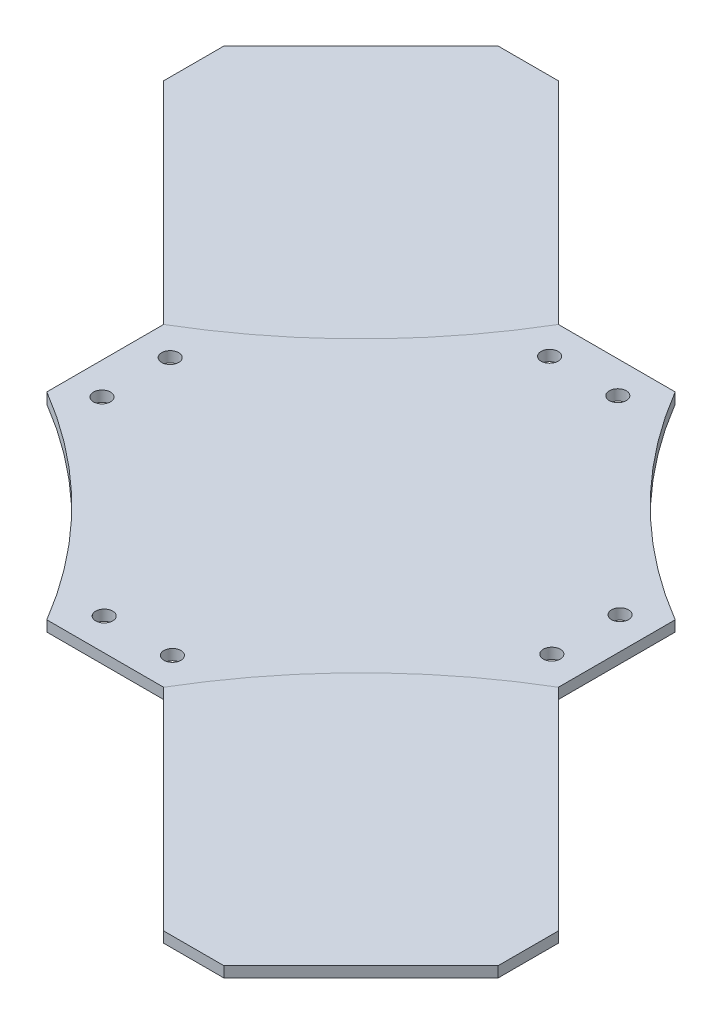
ISO-10303-21;
HEADER;
FILE_DESCRIPTION(('STEP AP214'),'2;1');
FILE_NAME('part.step','',(''),(''),'','','');
FILE_SCHEMA(('AUTOMOTIVE_DESIGN { 1 0 10303 214 1 1 1 1 }'));
ENDSEC;
DATA;
#1=APPLICATION_CONTEXT('core data for automotive mechanical design processes');
#2=APPLICATION_PROTOCOL_DEFINITION('international standard','automotive_design',2000,#1);
#3=PRODUCT_CONTEXT('',#1,'mechanical');
#4=PRODUCT('Part','Part','',(#3));
#5=PRODUCT_RELATED_PRODUCT_CATEGORY('part','',(#4));
#6=PRODUCT_DEFINITION_FORMATION('','',#4);
#7=PRODUCT_DEFINITION_CONTEXT('part definition',#1,'design');
#8=PRODUCT_DEFINITION('design','',#6,#7);
#9=PRODUCT_DEFINITION_SHAPE('','',#8);
#10=(LENGTH_UNIT() NAMED_UNIT(*) SI_UNIT(.MILLI.,.METRE.));
#11=(NAMED_UNIT(*) PLANE_ANGLE_UNIT() SI_UNIT($,.RADIAN.));
#12=(NAMED_UNIT(*) SI_UNIT($,.STERADIAN.) SOLID_ANGLE_UNIT());
#13=UNCERTAINTY_MEASURE_WITH_UNIT(LENGTH_MEASURE(1.E-05),#10,'distance_accuracy_value','');
#14=(GEOMETRIC_REPRESENTATION_CONTEXT(3) GLOBAL_UNCERTAINTY_ASSIGNED_CONTEXT((#13)) GLOBAL_UNIT_ASSIGNED_CONTEXT((#10,
#11,#12)) REPRESENTATION_CONTEXT('',''));
#15=CARTESIAN_POINT('',(0.,0.,0.));
#16=DIRECTION('',(0.,0.,1.));
#17=DIRECTION('',(1.,0.,0.));
#18=AXIS2_PLACEMENT_3D('',#15,#16,#17);
#19=CARTESIAN_POINT('',(126.747724256715,0.,126.747724256715));
#20=DIRECTION('',(0.,1.,0.));
#21=DIRECTION('',(-1.,0.,0.));
#22=AXIS2_PLACEMENT_3D('',#19,#20,#21);
#23=CYLINDRICAL_SURFACE('',#22,131.282316604609);
#24=CARTESIAN_POINT('',(126.747724256715,2.5,126.747724256715));
#25=DIRECTION('',(0.,-1.,0.));
#26=DIRECTION('',(-1.,0.,0.));
#27=AXIS2_PLACEMENT_3D('',#24,#25,#26);
#28=CIRCLE('',#27,131.282316604609);
#29=CARTESIAN_POINT('',(13.7000000000004,2.5,60.));
#30=VERTEX_POINT('',#29);
#31=CARTESIAN_POINT('',(59.9999999999999,2.5,13.7000000000003));
#32=VERTEX_POINT('',#31);
#33=EDGE_CURVE('E129',#30,#32,#28,.T.);
#34=ORIENTED_EDGE('',*,*,#33,.T.);
#35=DIRECTION('',(0.,1.,0.));
#36=VECTOR('',#35,1.);
#37=CARTESIAN_POINT('',(59.9999999999999,0.,13.7000000000003));
#38=LINE('',#37,#36);
#39=CARTESIAN_POINT('',(59.9999999999999,0.,13.7000000000003));
#40=VERTEX_POINT('',#39);
#41=EDGE_CURVE('E48',#40,#32,#38,.T.);
#42=ORIENTED_EDGE('',*,*,#41,.F.);
#43=CARTESIAN_POINT('',(126.747724256715,0.,126.747724256715));
#44=DIRECTION('',(0.,-1.,0.));
#45=DIRECTION('',(-1.,0.,0.));
#46=AXIS2_PLACEMENT_3D('',#43,#44,#45);
#47=CIRCLE('',#46,131.282316604609);
#48=CARTESIAN_POINT('',(13.7000000000004,0.,60.));
#49=VERTEX_POINT('',#48);
#50=EDGE_CURVE('E138',#49,#40,#47,.T.);
#51=ORIENTED_EDGE('',*,*,#50,.F.);
#52=DIRECTION('',(0.,1.,0.));
#53=VECTOR('',#52,1.);
#54=CARTESIAN_POINT('',(13.7000000000004,0.,60.));
#55=LINE('',#54,#53);
#56=EDGE_CURVE('E12',#49,#30,#55,.T.);
#57=ORIENTED_EDGE('',*,*,#56,.T.);
#58=EDGE_LOOP('',(#34,#42,#51,#57));
#59=FACE_BOUND('',#58,.T.);
#60=ADVANCED_FACE('F45',(#59),#23,.T.);
#61=CARTESIAN_POINT('',(13.7000000000004,0.,60.));
#62=DIRECTION('',(-0.707106781186547,0.,0.707106781186548));
#63=DIRECTION('',(-0.707106781186548,0.,-0.707106781186547));
#64=AXIS2_PLACEMENT_3D('',#61,#62,#63);
#65=PLANE('',#64);
#66=DIRECTION('',(-0.707106781186548,0.,-0.707106781186547));
#67=VECTOR('',#66,1.);
#68=CARTESIAN_POINT('',(13.7000000000004,2.5,60.));
#69=LINE('',#68,#67);
#70=CARTESIAN_POINT('',(63.1974746830588,2.5,109.497474683058));
#71=VERTEX_POINT('',#70);
#72=EDGE_CURVE('E92',#71,#30,#69,.T.);
#73=ORIENTED_EDGE('',*,*,#72,.T.);
#74=ORIENTED_EDGE('',*,*,#56,.F.);
#75=DIRECTION('',(-0.707106781186548,0.,-0.707106781186547));
#76=VECTOR('',#75,1.);
#77=CARTESIAN_POINT('',(13.7000000000004,0.,60.));
#78=LINE('',#77,#76);
#79=CARTESIAN_POINT('',(63.1974746830588,0.,109.497474683058));
#80=VERTEX_POINT('',#79);
#81=EDGE_CURVE('E63',#80,#49,#78,.T.);
#82=ORIENTED_EDGE('',*,*,#81,.F.);
#83=DIRECTION('',(0.,1.,0.));
#84=VECTOR('',#83,1.);
#85=CARTESIAN_POINT('',(63.1974746830588,0.,109.497474683058));
#86=LINE('',#85,#84);
#87=EDGE_CURVE('E54',#80,#71,#86,.T.);
#88=ORIENTED_EDGE('',*,*,#87,.T.);
#89=EDGE_LOOP('',(#73,#74,#82,#88));
#90=FACE_BOUND('',#89,.T.);
#91=ADVANCED_FACE('F163',(#90),#65,.T.);
#92=CARTESIAN_POINT('',(63.1974746830588,0.,109.497474683058));
#93=DIRECTION('',(0.,0.,1.));
#94=DIRECTION('',(-1.,0.,0.));
#95=AXIS2_PLACEMENT_3D('',#92,#93,#94);
#96=PLANE('',#95);
#97=DIRECTION('',(-1.,0.,0.));
#98=VECTOR('',#97,1.);
#99=CARTESIAN_POINT('',(63.1974746830588,2.5,109.497474683058));
#100=LINE('',#99,#98);
#101=CARTESIAN_POINT('',(77.3396103067897,2.5,109.497474683058));
#102=VERTEX_POINT('',#101);
#103=EDGE_CURVE('E86',#102,#71,#100,.T.);
#104=ORIENTED_EDGE('',*,*,#103,.T.);
#105=ORIENTED_EDGE('',*,*,#87,.F.);
#106=DIRECTION('',(-1.,0.,0.));
#107=VECTOR('',#106,1.);
#108=CARTESIAN_POINT('',(63.1974746830588,0.,109.497474683058));
#109=LINE('',#108,#107);
#110=CARTESIAN_POINT('',(77.3396103067897,0.,109.497474683058));
#111=VERTEX_POINT('',#110);
#112=EDGE_CURVE('E111',#111,#80,#109,.T.);
#113=ORIENTED_EDGE('',*,*,#112,.F.);
#114=DIRECTION('',(0.,1.,0.));
#115=VECTOR('',#114,1.);
#116=CARTESIAN_POINT('',(77.3396103067897,0.,109.497474683058));
#117=LINE('',#116,#115);
#118=EDGE_CURVE('E118',#111,#102,#117,.T.);
#119=ORIENTED_EDGE('',*,*,#118,.T.);
#120=EDGE_LOOP('',(#104,#105,#113,#119));
#121=FACE_BOUND('',#120,.T.);
#122=ADVANCED_FACE('F124',(#121),#96,.T.);
#123=CARTESIAN_POINT('',(109.497474683058,0.,77.3396103067897));
#124=DIRECTION('',(0.707106781186545,0.,0.70710678118655));
#125=DIRECTION('',(-0.70710678118655,0.,0.707106781186545));
#126=AXIS2_PLACEMENT_3D('',#123,#124,#125);
#127=PLANE('',#126);
#128=DIRECTION('',(-0.70710678118655,0.,0.707106781186545));
#129=VECTOR('',#128,1.);
#130=CARTESIAN_POINT('',(109.497474683058,2.5,77.3396103067897));
#131=LINE('',#130,#129);
#132=CARTESIAN_POINT('',(109.497474683058,2.5,77.3396103067897));
#133=VERTEX_POINT('',#132);
#134=EDGE_CURVE('E121',#133,#102,#131,.T.);
#135=ORIENTED_EDGE('',*,*,#134,.T.);
#136=ORIENTED_EDGE('',*,*,#118,.F.);
#137=DIRECTION('',(-0.70710678118655,0.,0.707106781186545));
#138=VECTOR('',#137,1.);
#139=CARTESIAN_POINT('',(109.497474683058,0.,77.3396103067897));
#140=LINE('',#139,#138);
#141=CARTESIAN_POINT('',(109.497474683058,0.,77.3396103067897));
#142=VERTEX_POINT('',#141);
#143=EDGE_CURVE('E107',#142,#111,#140,.T.);
#144=ORIENTED_EDGE('',*,*,#143,.F.);
#145=DIRECTION('',(0.,1.,0.));
#146=VECTOR('',#145,1.);
#147=CARTESIAN_POINT('',(109.497474683058,0.,77.3396103067897));
#148=LINE('',#147,#146);
#149=EDGE_CURVE('E122',#142,#133,#148,.T.);
#150=ORIENTED_EDGE('',*,*,#149,.T.);
#151=EDGE_LOOP('',(#135,#136,#144,#150));
#152=FACE_BOUND('',#151,.T.);
#153=ADVANCED_FACE('F119',(#152),#127,.T.);
#154=CARTESIAN_POINT('',(109.497474683059,0.,63.1974746830588));
#155=DIRECTION('',(1.,0.,0.));
#156=DIRECTION('',(0.,0.,1.));
#157=AXIS2_PLACEMENT_3D('',#154,#155,#156);
#158=PLANE('',#157);
#159=DIRECTION('',(0.,0.,1.));
#160=VECTOR('',#159,1.);
#161=CARTESIAN_POINT('',(109.497474683059,2.5,63.1974746830588));
#162=LINE('',#161,#160);
#163=CARTESIAN_POINT('',(109.497474683059,2.5,63.1974746830588));
#164=VERTEX_POINT('',#163);
#165=EDGE_CURVE('E134',#164,#133,#162,.T.);
#166=ORIENTED_EDGE('',*,*,#165,.T.);
#167=ORIENTED_EDGE('',*,*,#149,.F.);
#168=DIRECTION('',(0.,0.,1.));
#169=VECTOR('',#168,1.);
#170=CARTESIAN_POINT('',(109.497474683059,0.,63.1974746830588));
#171=LINE('',#170,#169);
#172=CARTESIAN_POINT('',(109.497474683059,0.,63.1974746830588));
#173=VERTEX_POINT('',#172);
#174=EDGE_CURVE('E113',#173,#142,#171,.T.);
#175=ORIENTED_EDGE('',*,*,#174,.F.);
#176=DIRECTION('',(0.,1.,0.));
#177=VECTOR('',#176,1.);
#178=CARTESIAN_POINT('',(109.497474683059,0.,63.1974746830588));
#179=LINE('',#178,#177);
#180=EDGE_CURVE('E141',#173,#164,#179,.T.);
#181=ORIENTED_EDGE('',*,*,#180,.T.);
#182=EDGE_LOOP('',(#166,#167,#175,#181));
#183=FACE_BOUND('',#182,.T.);
#184=ADVANCED_FACE('F152',(#183),#158,.T.);
#185=CARTESIAN_POINT('',(59.9999999999999,0.,13.7000000000003));
#186=DIRECTION('',(0.707106781186547,0.,-0.707106781186548));
#187=DIRECTION('',(0.707106781186548,0.,0.707106781186547));
#188=AXIS2_PLACEMENT_3D('',#185,#186,#187);
#189=PLANE('',#188);
#190=DIRECTION('',(0.707106781186548,0.,0.707106781186547));
#191=VECTOR('',#190,1.);
#192=CARTESIAN_POINT('',(59.9999999999999,2.5,13.7000000000003));
#193=LINE('',#192,#191);
#194=EDGE_CURVE('E132',#32,#164,#193,.T.);
#195=ORIENTED_EDGE('',*,*,#194,.T.);
#196=ORIENTED_EDGE('',*,*,#180,.F.);
#197=DIRECTION('',(0.707106781186548,0.,0.707106781186547));
#198=VECTOR('',#197,1.);
#199=CARTESIAN_POINT('',(59.9999999999999,0.,13.7000000000003));
#200=LINE('',#199,#198);
#201=EDGE_CURVE('E100',#40,#173,#200,.T.);
#202=ORIENTED_EDGE('',*,*,#201,.F.);
#203=ORIENTED_EDGE('',*,*,#41,.T.);
#204=EDGE_LOOP('',(#195,#196,#202,#203));
#205=FACE_BOUND('',#204,.T.);
#206=ADVANCED_FACE('F146',(#205),#189,.T.);
#207=CARTESIAN_POINT('',(126.747724256715,0.,126.747724256715));
#208=DIRECTION('',(0.,1.,0.));
#209=DIRECTION('',(-1.,0.,0.));
#210=AXIS2_PLACEMENT_3D('',#207,#208,#209);
#211=PLANE('',#210);
#212=ORIENTED_EDGE('',*,*,#50,.T.);
#213=ORIENTED_EDGE('',*,*,#201,.T.);
#214=ORIENTED_EDGE('',*,*,#174,.T.);
#215=ORIENTED_EDGE('',*,*,#143,.T.);
#216=ORIENTED_EDGE('',*,*,#112,.T.);
#217=ORIENTED_EDGE('',*,*,#81,.T.);
#218=EDGE_LOOP('',(#212,#213,#214,#215,#216,#217));
#219=FACE_BOUND('',#218,.T.);
#220=ADVANCED_FACE('F109',(#219),#211,.F.);
#221=CARTESIAN_POINT('',(126.747724256715,2.5,126.747724256715));
#222=DIRECTION('',(0.,1.,0.));
#223=DIRECTION('',(-1.,0.,0.));
#224=AXIS2_PLACEMENT_3D('',#221,#222,#223);
#225=PLANE('',#224);
#226=ORIENTED_EDGE('',*,*,#33,.F.);
#227=ORIENTED_EDGE('',*,*,#72,.F.);
#228=ORIENTED_EDGE('',*,*,#103,.F.);
#229=ORIENTED_EDGE('',*,*,#134,.F.);
#230=ORIENTED_EDGE('',*,*,#165,.F.);
#231=ORIENTED_EDGE('',*,*,#194,.F.);
#232=EDGE_LOOP('',(#226,#227,#228,#229,#230,#231));
#233=FACE_BOUND('',#232,.T.);
#234=ADVANCED_FACE('F151',(#233),#225,.T.);
#235=CLOSED_SHELL('',(#60,#91,#122,#153,#184,#206,#220,#234));
#236=MANIFOLD_SOLID_BREP('B2',#235);
#237=CARTESIAN_POINT('',(-126.747724256714,0.,-126.747724256716));
#238=DIRECTION('',(0.,1.,0.));
#239=DIRECTION('',(0.,0.,1.));
#240=AXIS2_PLACEMENT_3D('',#237,#238,#239);
#241=CYLINDRICAL_SURFACE('',#240,131.282316604609);
#242=CARTESIAN_POINT('',(-126.747724256714,2.5,-126.747724256716));
#243=DIRECTION('',(0.,1.,0.));
#244=DIRECTION('',(0.,0.,1.));
#245=AXIS2_PLACEMENT_3D('',#242,#243,#244);
#246=CIRCLE('',#245,131.282316604609);
#247=CARTESIAN_POINT('',(-59.9999999999999,2.5,-13.7000000000006));
#248=VERTEX_POINT('',#247);
#249=CARTESIAN_POINT('',(-13.7,2.5,-60.));
#250=VERTEX_POINT('',#249);
#251=EDGE_CURVE('E314',#248,#250,#246,.T.);
#252=ORIENTED_EDGE('',*,*,#251,.F.);
#253=DIRECTION('',(0.,1.,0.));
#254=VECTOR('',#253,1.);
#255=CARTESIAN_POINT('',(-59.9999999999999,0.,-13.7000000000006));
#256=LINE('',#255,#254);
#257=CARTESIAN_POINT('',(-59.9999999999999,0.,-13.7000000000006));
#258=VERTEX_POINT('',#257);
#259=EDGE_CURVE('E43',#258,#248,#256,.T.);
#260=ORIENTED_EDGE('',*,*,#259,.F.);
#261=CARTESIAN_POINT('',(-126.747724256714,0.,-126.747724256716));
#262=DIRECTION('',(0.,1.,0.));
#263=DIRECTION('',(0.,0.,1.));
#264=AXIS2_PLACEMENT_3D('',#261,#262,#263);
#265=CIRCLE('',#264,131.282316604609);
#266=CARTESIAN_POINT('',(-13.7,0.,-60.));
#267=VERTEX_POINT('',#266);
#268=EDGE_CURVE('E328',#258,#267,#265,.T.);
#269=ORIENTED_EDGE('',*,*,#268,.T.);
#270=DIRECTION('',(0.,1.,0.));
#271=VECTOR('',#270,1.);
#272=CARTESIAN_POINT('',(-13.7,0.,-60.));
#273=LINE('',#272,#271);
#274=EDGE_CURVE('E232',#267,#250,#273,.T.);
#275=ORIENTED_EDGE('',*,*,#274,.T.);
#276=EDGE_LOOP('',(#252,#260,#269,#275));
#277=FACE_BOUND('',#276,.T.);
#278=ADVANCED_FACE('F229',(#277),#241,.T.);
#279=CARTESIAN_POINT('',(-59.9999999999999,0.,-13.7000000000006));
#280=DIRECTION('',(-0.707106781186551,0.,0.707106781186544));
#281=DIRECTION('',(0.707106781186544,0.,0.707106781186551));
#282=AXIS2_PLACEMENT_3D('',#279,#280,#281);
#283=PLANE('',#282);
#284=DIRECTION('',(0.707106781186544,0.,0.707106781186551));
#285=VECTOR('',#284,1.);
#286=CARTESIAN_POINT('',(-59.9999999999999,2.5,-13.7000000000006));
#287=LINE('',#286,#285);
#288=CARTESIAN_POINT('',(-109.497474683058,2.5,-63.1974746830592));
#289=VERTEX_POINT('',#288);
#290=EDGE_CURVE('E326',#289,#248,#287,.T.);
#291=ORIENTED_EDGE('',*,*,#290,.F.);
#292=DIRECTION('',(0.,1.,0.));
#293=VECTOR('',#292,1.);
#294=CARTESIAN_POINT('',(-109.497474683058,0.,-63.1974746830592));
#295=LINE('',#294,#293);
#296=CARTESIAN_POINT('',(-109.497474683058,0.,-63.1974746830592));
#297=VERTEX_POINT('',#296);
#298=EDGE_CURVE('E238',#297,#289,#295,.T.);
#299=ORIENTED_EDGE('',*,*,#298,.F.);
#300=DIRECTION('',(0.707106781186544,0.,0.707106781186551));
#301=VECTOR('',#300,1.);
#302=CARTESIAN_POINT('',(-59.9999999999999,0.,-13.7000000000006));
#303=LINE('',#302,#301);
#304=EDGE_CURVE('E304',#297,#258,#303,.T.);
#305=ORIENTED_EDGE('',*,*,#304,.T.);
#306=ORIENTED_EDGE('',*,*,#259,.T.);
#307=EDGE_LOOP('',(#291,#299,#305,#306));
#308=FACE_BOUND('',#307,.T.);
#309=ADVANCED_FACE('F336',(#308),#283,.T.);
#310=CARTESIAN_POINT('',(-109.497474683058,0.,-63.1974746830592));
#311=DIRECTION('',(-1.,0.,0.));
#312=DIRECTION('',(0.,0.,1.));
#313=AXIS2_PLACEMENT_3D('',#310,#311,#312);
#314=PLANE('',#313);
#315=DIRECTION('',(0.,0.,1.));
#316=VECTOR('',#315,1.);
#317=CARTESIAN_POINT('',(-109.497474683058,2.5,-63.1974746830592));
#318=LINE('',#317,#316);
#319=CARTESIAN_POINT('',(-109.497474683058,2.5,-77.3396103067902));
#320=VERTEX_POINT('',#319);
#321=EDGE_CURVE('E291',#320,#289,#318,.T.);
#322=ORIENTED_EDGE('',*,*,#321,.F.);
#323=DIRECTION('',(0.,1.,0.));
#324=VECTOR('',#323,1.);
#325=CARTESIAN_POINT('',(-109.497474683058,0.,-77.3396103067902));
#326=LINE('',#325,#324);
#327=CARTESIAN_POINT('',(-109.497474683058,0.,-77.3396103067902));
#328=VERTEX_POINT('',#327);
#329=EDGE_CURVE('E286',#328,#320,#326,.T.);
#330=ORIENTED_EDGE('',*,*,#329,.F.);
#331=DIRECTION('',(0.,0.,1.));
#332=VECTOR('',#331,1.);
#333=CARTESIAN_POINT('',(-109.497474683058,0.,-63.1974746830592));
#334=LINE('',#333,#332);
#335=EDGE_CURVE('E289',#328,#297,#334,.T.);
#336=ORIENTED_EDGE('',*,*,#335,.T.);
#337=ORIENTED_EDGE('',*,*,#298,.T.);
#338=EDGE_LOOP('',(#322,#330,#336,#337));
#339=FACE_BOUND('',#338,.T.);
#340=ADVANCED_FACE('F288',(#339),#314,.T.);
#341=CARTESIAN_POINT('',(-77.3396103067892,0.,-109.497474683059));
#342=DIRECTION('',(-0.707106781186547,0.,-0.707106781186548));
#343=DIRECTION('',(-0.707106781186548,0.,0.707106781186547));
#344=AXIS2_PLACEMENT_3D('',#341,#342,#343);
#345=PLANE('',#344);
#346=DIRECTION('',(-0.707106781186548,0.,0.707106781186547));
#347=VECTOR('',#346,1.);
#348=CARTESIAN_POINT('',(-77.3396103067892,2.5,-109.497474683059));
#349=LINE('',#348,#347);
#350=CARTESIAN_POINT('',(-77.3396103067892,2.5,-109.497474683059));
#351=VERTEX_POINT('',#350);
#352=EDGE_CURVE('E323',#351,#320,#349,.T.);
#353=ORIENTED_EDGE('',*,*,#352,.F.);
#354=DIRECTION('',(0.,1.,0.));
#355=VECTOR('',#354,1.);
#356=CARTESIAN_POINT('',(-77.3396103067892,0.,-109.497474683059));
#357=LINE('',#356,#355);
#358=CARTESIAN_POINT('',(-77.3396103067892,0.,-109.497474683059));
#359=VERTEX_POINT('',#358);
#360=EDGE_CURVE('E296',#359,#351,#357,.T.);
#361=ORIENTED_EDGE('',*,*,#360,.F.);
#362=DIRECTION('',(-0.707106781186548,0.,0.707106781186547));
#363=VECTOR('',#362,1.);
#364=CARTESIAN_POINT('',(-77.3396103067892,0.,-109.497474683059));
#365=LINE('',#364,#363);
#366=EDGE_CURVE('E302',#359,#328,#365,.T.);
#367=ORIENTED_EDGE('',*,*,#366,.T.);
#368=ORIENTED_EDGE('',*,*,#329,.T.);
#369=EDGE_LOOP('',(#353,#361,#367,#368));
#370=FACE_BOUND('',#369,.T.);
#371=ADVANCED_FACE('F306',(#370),#345,.T.);
#372=CARTESIAN_POINT('',(-63.1974746830583,0.,-109.497474683059));
#373=DIRECTION('',(0.,0.,-1.));
#374=DIRECTION('',(-1.,0.,0.));
#375=AXIS2_PLACEMENT_3D('',#372,#373,#374);
#376=PLANE('',#375);
#377=DIRECTION('',(-1.,0.,0.));
#378=VECTOR('',#377,1.);
#379=CARTESIAN_POINT('',(-63.1974746830583,2.5,-109.497474683059));
#380=LINE('',#379,#378);
#381=CARTESIAN_POINT('',(-63.1974746830583,2.5,-109.497474683059));
#382=VERTEX_POINT('',#381);
#383=EDGE_CURVE('E320',#382,#351,#380,.T.);
#384=ORIENTED_EDGE('',*,*,#383,.F.);
#385=DIRECTION('',(0.,1.,0.));
#386=VECTOR('',#385,1.);
#387=CARTESIAN_POINT('',(-63.1974746830583,0.,-109.497474683059));
#388=LINE('',#387,#386);
#389=CARTESIAN_POINT('',(-63.1974746830583,0.,-109.497474683059));
#390=VERTEX_POINT('',#389);
#391=EDGE_CURVE('E331',#390,#382,#388,.T.);
#392=ORIENTED_EDGE('',*,*,#391,.F.);
#393=DIRECTION('',(-1.,0.,0.));
#394=VECTOR('',#393,1.);
#395=CARTESIAN_POINT('',(-63.1974746830583,0.,-109.497474683059));
#396=LINE('',#395,#394);
#397=EDGE_CURVE('E307',#390,#359,#396,.T.);
#398=ORIENTED_EDGE('',*,*,#397,.T.);
#399=ORIENTED_EDGE('',*,*,#360,.T.);
#400=EDGE_LOOP('',(#384,#392,#398,#399));
#401=FACE_BOUND('',#400,.T.);
#402=ADVANCED_FACE('F349',(#401),#376,.T.);
#403=CARTESIAN_POINT('',(-13.7,0.,-60.));
#404=DIRECTION('',(0.707106781186551,0.,-0.707106781186544));
#405=DIRECTION('',(-0.707106781186544,0.,-0.707106781186551));
#406=AXIS2_PLACEMENT_3D('',#403,#404,#405);
#407=PLANE('',#406);
#408=DIRECTION('',(-0.707106781186544,0.,-0.707106781186551));
#409=VECTOR('',#408,1.);
#410=CARTESIAN_POINT('',(-13.7,2.5,-60.));
#411=LINE('',#410,#409);
#412=EDGE_CURVE('E317',#250,#382,#411,.T.);
#413=ORIENTED_EDGE('',*,*,#412,.F.);
#414=ORIENTED_EDGE('',*,*,#274,.F.);
#415=DIRECTION('',(-0.707106781186544,0.,-0.707106781186551));
#416=VECTOR('',#415,1.);
#417=CARTESIAN_POINT('',(-13.7,0.,-60.));
#418=LINE('',#417,#416);
#419=EDGE_CURVE('E309',#267,#390,#418,.T.);
#420=ORIENTED_EDGE('',*,*,#419,.T.);
#421=ORIENTED_EDGE('',*,*,#391,.T.);
#422=EDGE_LOOP('',(#413,#414,#420,#421));
#423=FACE_BOUND('',#422,.T.);
#424=ADVANCED_FACE('F333',(#423),#407,.T.);
#425=CARTESIAN_POINT('',(-126.747724256714,0.,-126.747724256716));
#426=DIRECTION('',(0.,1.,0.));
#427=DIRECTION('',(0.,0.,1.));
#428=AXIS2_PLACEMENT_3D('',#425,#426,#427);
#429=PLANE('',#428);
#430=ORIENTED_EDGE('',*,*,#268,.F.);
#431=ORIENTED_EDGE('',*,*,#304,.F.);
#432=ORIENTED_EDGE('',*,*,#335,.F.);
#433=ORIENTED_EDGE('',*,*,#366,.F.);
#434=ORIENTED_EDGE('',*,*,#397,.F.);
#435=ORIENTED_EDGE('',*,*,#419,.F.);
#436=EDGE_LOOP('',(#430,#431,#432,#433,#434,#435));
#437=FACE_BOUND('',#436,.T.);
#438=ADVANCED_FACE('F300',(#437),#429,.F.);
#439=CARTESIAN_POINT('',(-126.747724256714,2.5,-126.747724256716));
#440=DIRECTION('',(0.,1.,0.));
#441=DIRECTION('',(0.,0.,1.));
#442=AXIS2_PLACEMENT_3D('',#439,#440,#441);
#443=PLANE('',#442);
#444=ORIENTED_EDGE('',*,*,#251,.T.);
#445=ORIENTED_EDGE('',*,*,#412,.T.);
#446=ORIENTED_EDGE('',*,*,#383,.T.);
#447=ORIENTED_EDGE('',*,*,#352,.T.);
#448=ORIENTED_EDGE('',*,*,#321,.T.);
#449=ORIENTED_EDGE('',*,*,#290,.T.);
#450=EDGE_LOOP('',(#444,#445,#446,#447,#448,#449));
#451=FACE_BOUND('',#450,.T.);
#452=ADVANCED_FACE('F335',(#451),#443,.T.);
#453=CLOSED_SHELL('',(#278,#309,#340,#371,#402,#424,#438,#452));
#454=MANIFOLD_SOLID_BREP('B6',#453);
#455=CARTESIAN_POINT('',(126.747724256716,2.5,-126.747724256714));
#456=DIRECTION('',(0.,-1.,0.));
#457=DIRECTION('',(0.,0.,-1.));
#458=AXIS2_PLACEMENT_3D('',#455,#456,#457);
#459=CYLINDRICAL_SURFACE('',#458,131.282316604609);
#460=CARTESIAN_POINT('',(126.747724256716,0.,-126.747724256714));
#461=DIRECTION('',(0.,-1.,0.));
#462=DIRECTION('',(0.,0.,-1.));
#463=AXIS2_PLACEMENT_3D('',#460,#461,#462);
#464=CIRCLE('',#463,131.282316604609);
#465=CARTESIAN_POINT('',(60.,0.,-13.6999999999998));
#466=VERTEX_POINT('',#465);
#467=CARTESIAN_POINT('',(13.7,0.,-60.));
#468=VERTEX_POINT('',#467);
#469=EDGE_CURVE('E500',#466,#468,#464,.T.);
#470=ORIENTED_EDGE('',*,*,#469,.T.);
#471=DIRECTION('',(0.,-1.,0.));
#472=VECTOR('',#471,1.);
#473=CARTESIAN_POINT('',(13.7,2.5,-60.));
#474=LINE('',#473,#472);
#475=CARTESIAN_POINT('',(13.7,2.5,-60.));
#476=VERTEX_POINT('',#475);
#477=EDGE_CURVE('E227',#476,#468,#474,.T.);
#478=ORIENTED_EDGE('',*,*,#477,.F.);
#479=CARTESIAN_POINT('',(126.747724256716,2.5,-126.747724256714));
#480=DIRECTION('',(0.,-1.,0.));
#481=DIRECTION('',(0.,0.,-1.));
#482=AXIS2_PLACEMENT_3D('',#479,#480,#481);
#483=CIRCLE('',#482,131.282316604609);
#484=CARTESIAN_POINT('',(60.,2.5,-13.6999999999998));
#485=VERTEX_POINT('',#484);
#486=EDGE_CURVE('E515',#485,#476,#483,.T.);
#487=ORIENTED_EDGE('',*,*,#486,.F.);
#488=DIRECTION('',(0.,-1.,0.));
#489=VECTOR('',#488,1.);
#490=CARTESIAN_POINT('',(60.,2.5,-13.6999999999998));
#491=LINE('',#490,#489);
#492=EDGE_CURVE('E496',#485,#466,#491,.T.);
#493=ORIENTED_EDGE('',*,*,#492,.T.);
#494=EDGE_LOOP('',(#470,#478,#487,#493));
#495=FACE_BOUND('',#494,.T.);
#496=ADVANCED_FACE('F404',(#495),#459,.F.);
#497=CARTESIAN_POINT('',(-13.7,2.5,-60.));
#498=DIRECTION('',(0.,0.,1.));
#499=DIRECTION('',(1.,0.,0.));
#500=AXIS2_PLACEMENT_3D('',#497,#498,#499);
#501=PLANE('',#500);
#502=DIRECTION('',(-1.,0.,0.));
#503=VECTOR('',#502,1.);
#504=CARTESIAN_POINT('',(-13.7,0.,-60.));
#505=LINE('',#504,#503);
#506=CARTESIAN_POINT('',(-13.7,0.,-60.));
#507=VERTEX_POINT('',#506);
#508=EDGE_CURVE('E503',#468,#507,#505,.T.);
#509=ORIENTED_EDGE('',*,*,#508,.T.);
#510=DIRECTION('',(0.,-1.,0.));
#511=VECTOR('',#510,1.);
#512=CARTESIAN_POINT('',(-13.7,2.5,-60.));
#513=LINE('',#512,#511);
#514=CARTESIAN_POINT('',(-13.7,2.5,-60.));
#515=VERTEX_POINT('',#514);
#516=EDGE_CURVE('E412',#515,#507,#513,.T.);
#517=ORIENTED_EDGE('',*,*,#516,.F.);
#518=DIRECTION('',(-1.,0.,0.));
#519=VECTOR('',#518,1.);
#520=CARTESIAN_POINT('',(-13.7,2.5,-60.));
#521=LINE('',#520,#519);
#522=EDGE_CURVE('E463',#476,#515,#521,.T.);
#523=ORIENTED_EDGE('',*,*,#522,.F.);
#524=ORIENTED_EDGE('',*,*,#477,.T.);
#525=EDGE_LOOP('',(#509,#517,#523,#524));
#526=FACE_BOUND('',#525,.T.);
#527=ADVANCED_FACE('F632',(#526),#501,.F.);
#528=CARTESIAN_POINT('',(-126.747724256714,2.5,-126.747724256716));
#529=DIRECTION('',(0.,-1.,0.));
#530=DIRECTION('',(0.,0.,-1.));
#531=AXIS2_PLACEMENT_3D('',#528,#529,#530);
#532=CYLINDRICAL_SURFACE('',#531,131.282316604609);
#533=CARTESIAN_POINT('',(-126.747724256714,0.,-126.747724256716));
#534=DIRECTION('',(0.,-1.,0.));
#535=DIRECTION('',(0.,0.,-1.));
#536=AXIS2_PLACEMENT_3D('',#533,#534,#535);
#537=CIRCLE('',#536,131.282316604609);
#538=CARTESIAN_POINT('',(-59.9999999999999,0.,-13.7000000000006));
#539=VERTEX_POINT('',#538);
#540=EDGE_CURVE('E506',#507,#539,#537,.T.);
#541=ORIENTED_EDGE('',*,*,#540,.T.);
#542=DIRECTION('',(0.,-1.,0.));
#543=VECTOR('',#542,1.);
#544=CARTESIAN_POINT('',(-59.9999999999999,2.5,-13.7000000000006));
#545=LINE('',#544,#543);
#546=CARTESIAN_POINT('',(-59.9999999999999,2.5,-13.7000000000006));
#547=VERTEX_POINT('',#546);
#548=EDGE_CURVE('E522',#547,#539,#545,.T.);
#549=ORIENTED_EDGE('',*,*,#548,.F.);
#550=CARTESIAN_POINT('',(-126.747724256714,2.5,-126.747724256716));
#551=DIRECTION('',(0.,-1.,0.));
#552=DIRECTION('',(0.,0.,-1.));
#553=AXIS2_PLACEMENT_3D('',#550,#551,#552);
#554=CIRCLE('',#553,131.282316604609);
#555=EDGE_CURVE('E530',#515,#547,#554,.T.);
#556=ORIENTED_EDGE('',*,*,#555,.F.);
#557=ORIENTED_EDGE('',*,*,#516,.T.);
#558=EDGE_LOOP('',(#541,#549,#556,#557));
#559=FACE_BOUND('',#558,.T.);
#560=ADVANCED_FACE('F528',(#559),#532,.F.);
#561=CARTESIAN_POINT('',(-60.0000000000002,2.5,13.6999999999994));
#562=DIRECTION('',(1.,0.,0.));
#563=DIRECTION('',(0.,0.,-1.));
#564=AXIS2_PLACEMENT_3D('',#561,#562,#563);
#565=PLANE('',#564);
#566=DIRECTION('',(0.,0.,1.));
#567=VECTOR('',#566,1.);
#568=CARTESIAN_POINT('',(-60.0000000000002,0.,13.6999999999994));
#569=LINE('',#568,#567);
#570=CARTESIAN_POINT('',(-60.0000000000002,0.,13.6999999999994));
#571=VERTEX_POINT('',#570);
#572=EDGE_CURVE('E508',#539,#571,#569,.T.);
#573=ORIENTED_EDGE('',*,*,#572,.T.);
#574=DIRECTION('',(0.,-1.,0.));
#575=VECTOR('',#574,1.);
#576=CARTESIAN_POINT('',(-60.0000000000002,2.5,13.6999999999994));
#577=LINE('',#576,#575);
#578=CARTESIAN_POINT('',(-60.0000000000002,2.5,13.6999999999994));
#579=VERTEX_POINT('',#578);
#580=EDGE_CURVE('E519',#579,#571,#577,.T.);
#581=ORIENTED_EDGE('',*,*,#580,.F.);
#582=DIRECTION('',(0.,0.,1.));
#583=VECTOR('',#582,1.);
#584=CARTESIAN_POINT('',(-60.0000000000002,2.5,13.6999999999994));
#585=LINE('',#584,#583);
#586=EDGE_CURVE('E542',#547,#579,#585,.T.);
#587=ORIENTED_EDGE('',*,*,#586,.F.);
#588=ORIENTED_EDGE('',*,*,#548,.T.);
#589=EDGE_LOOP('',(#573,#581,#587,#588));
#590=FACE_BOUND('',#589,.T.);
#591=ADVANCED_FACE('F538',(#590),#565,.F.);
#592=CARTESIAN_POINT('',(-126.747724256717,2.5,126.747724256713));
#593=DIRECTION('',(0.,-1.,0.));
#594=DIRECTION('',(0.,0.,-1.));
#595=AXIS2_PLACEMENT_3D('',#592,#593,#594);
#596=CYLINDRICAL_SURFACE('',#595,131.282316604609);
#597=CARTESIAN_POINT('',(-126.747724256717,0.,126.747724256713));
#598=DIRECTION('',(0.,-1.,0.));
#599=DIRECTION('',(0.,0.,-1.));
#600=AXIS2_PLACEMENT_3D('',#597,#598,#599);
#601=CIRCLE('',#600,131.282316604609);
#602=CARTESIAN_POINT('',(-13.7000000000007,0.,60.0000000000001));
#603=VERTEX_POINT('',#602);
#604=EDGE_CURVE('E510',#571,#603,#601,.T.);
#605=ORIENTED_EDGE('',*,*,#604,.T.);
#606=DIRECTION('',(0.,-1.,0.));
#607=VECTOR('',#606,1.);
#608=CARTESIAN_POINT('',(-13.7000000000007,2.5,60.0000000000001));
#609=LINE('',#608,#607);
#610=CARTESIAN_POINT('',(-13.7000000000007,2.5,60.0000000000001));
#611=VERTEX_POINT('',#610);
#612=EDGE_CURVE('E491',#611,#603,#609,.T.);
#613=ORIENTED_EDGE('',*,*,#612,.F.);
#614=CARTESIAN_POINT('',(-126.747724256717,2.5,126.747724256713));
#615=DIRECTION('',(0.,-1.,0.));
#616=DIRECTION('',(0.,0.,-1.));
#617=AXIS2_PLACEMENT_3D('',#614,#615,#616);
#618=CIRCLE('',#617,131.282316604609);
#619=EDGE_CURVE('E482',#579,#611,#618,.T.);
#620=ORIENTED_EDGE('',*,*,#619,.F.);
#621=ORIENTED_EDGE('',*,*,#580,.T.);
#622=EDGE_LOOP('',(#605,#613,#620,#621));
#623=FACE_BOUND('',#622,.T.);
#624=ADVANCED_FACE('F541',(#623),#596,.F.);
#625=CARTESIAN_POINT('',(13.6999999999996,2.5,60.0000000000001));
#626=DIRECTION('',(0.,0.,-1.));
#627=DIRECTION('',(-1.,0.,0.));
#628=AXIS2_PLACEMENT_3D('',#625,#626,#627);
#629=PLANE('',#628);
#630=DIRECTION('',(1.,0.,0.));
#631=VECTOR('',#630,1.);
#632=CARTESIAN_POINT('',(13.6999999999996,0.,60.0000000000001));
#633=LINE('',#632,#631);
#634=CARTESIAN_POINT('',(13.6999999999996,0.,60.0000000000001));
#635=VERTEX_POINT('',#634);
#636=EDGE_CURVE('E490',#603,#635,#633,.T.);
#637=ORIENTED_EDGE('',*,*,#636,.T.);
#638=DIRECTION('',(0.,-1.,0.));
#639=VECTOR('',#638,1.);
#640=CARTESIAN_POINT('',(13.6999999999996,2.5,60.0000000000001));
#641=LINE('',#640,#639);
#642=CARTESIAN_POINT('',(13.6999999999996,2.5,60.0000000000001));
#643=VERTEX_POINT('',#642);
#644=EDGE_CURVE('E487',#643,#635,#641,.T.);
#645=ORIENTED_EDGE('',*,*,#644,.F.);
#646=DIRECTION('',(1.,0.,0.));
#647=VECTOR('',#646,1.);
#648=CARTESIAN_POINT('',(13.6999999999996,2.5,60.0000000000001));
#649=LINE('',#648,#647);
#650=EDGE_CURVE('E476',#611,#643,#649,.T.);
#651=ORIENTED_EDGE('',*,*,#650,.F.);
#652=ORIENTED_EDGE('',*,*,#612,.T.);
#653=EDGE_LOOP('',(#637,#645,#651,#652));
#654=FACE_BOUND('',#653,.T.);
#655=ADVANCED_FACE('F488',(#654),#629,.F.);
#656=CARTESIAN_POINT('',(126.747724256714,2.5,126.747724256717));
#657=DIRECTION('',(0.,-1.,0.));
#658=DIRECTION('',(0.,0.,-1.));
#659=AXIS2_PLACEMENT_3D('',#656,#657,#658);
#660=CYLINDRICAL_SURFACE('',#659,131.282316604609);
#661=CARTESIAN_POINT('',(126.747724256714,0.,126.747724256717));
#662=DIRECTION('',(0.,-1.,0.));
#663=DIRECTION('',(0.,0.,-1.));
#664=AXIS2_PLACEMENT_3D('',#661,#662,#663);
#665=CIRCLE('',#664,131.282316604609);
#666=CARTESIAN_POINT('',(60.0000000000001,0.,13.7000000000004));
#667=VERTEX_POINT('',#666);
#668=EDGE_CURVE('E449',#635,#667,#665,.T.);
#669=ORIENTED_EDGE('',*,*,#668,.T.);
#670=DIRECTION('',(0.,-1.,0.));
#671=VECTOR('',#670,1.);
#672=CARTESIAN_POINT('',(60.0000000000001,2.5,13.7000000000004));
#673=LINE('',#672,#671);
#674=CARTESIAN_POINT('',(60.0000000000001,2.5,13.7000000000004));
#675=VERTEX_POINT('',#674);
#676=EDGE_CURVE('E492',#675,#667,#673,.T.);
#677=ORIENTED_EDGE('',*,*,#676,.F.);
#678=CARTESIAN_POINT('',(126.747724256714,2.5,126.747724256717));
#679=DIRECTION('',(0.,-1.,0.));
#680=DIRECTION('',(0.,0.,-1.));
#681=AXIS2_PLACEMENT_3D('',#678,#679,#680);
#682=CIRCLE('',#681,131.282316604609);
#683=EDGE_CURVE('E480',#643,#675,#682,.T.);
#684=ORIENTED_EDGE('',*,*,#683,.F.);
#685=ORIENTED_EDGE('',*,*,#644,.T.);
#686=EDGE_LOOP('',(#669,#677,#684,#685));
#687=FACE_BOUND('',#686,.T.);
#688=ADVANCED_FACE('F494',(#687),#660,.F.);
#689=CARTESIAN_POINT('',(60.,2.5,-13.6999999999998));
#690=DIRECTION('',(-1.,0.,0.));
#691=DIRECTION('',(0.,0.,1.));
#692=AXIS2_PLACEMENT_3D('',#689,#690,#691);
#693=PLANE('',#692);
#694=DIRECTION('',(0.,0.,-1.));
#695=VECTOR('',#694,1.);
#696=CARTESIAN_POINT('',(60.,0.,-13.6999999999998));
#697=LINE('',#696,#695);
#698=EDGE_CURVE('E455',#667,#466,#697,.T.);
#699=ORIENTED_EDGE('',*,*,#698,.T.);
#700=ORIENTED_EDGE('',*,*,#492,.F.);
#701=DIRECTION('',(0.,0.,-1.));
#702=VECTOR('',#701,1.);
#703=CARTESIAN_POINT('',(60.,2.5,-13.6999999999998));
#704=LINE('',#703,#702);
#705=EDGE_CURVE('E420',#675,#485,#704,.T.);
#706=ORIENTED_EDGE('',*,*,#705,.F.);
#707=ORIENTED_EDGE('',*,*,#676,.T.);
#708=EDGE_LOOP('',(#699,#700,#706,#707));
#709=FACE_BOUND('',#708,.T.);
#710=ADVANCED_FACE('F608',(#709),#693,.F.);
#711=CARTESIAN_POINT('',(126.747724256716,2.5,-126.747724256714));
#712=DIRECTION('',(0.,-1.,0.));
#713=DIRECTION('',(0.,0.,-1.));
#714=AXIS2_PLACEMENT_3D('',#711,#712,#713);
#715=PLANE('',#714);
#716=CARTESIAN_POINT('',(52.4999999999999,2.5,-8.25971662402286));
#717=DIRECTION('',(0.,1.,0.));
#718=DIRECTION('',(-1.,0.,0.));
#719=AXIS2_PLACEMENT_3D('',#716,#717,#718);
#720=CIRCLE('',#719,2.);
#721=CARTESIAN_POINT('',(50.4999999999999,2.5,-8.25971662402284));
#722=VERTEX_POINT('',#721);
#723=EDGE_CURVE('E578',#722,#722,#720,.T.);
#724=ORIENTED_EDGE('',*,*,#723,.F.);
#725=EDGE_LOOP('',(#724));
#726=FACE_BOUND('',#725,.T.);
#727=CARTESIAN_POINT('',(-7.74028337597769,2.5,52.5));
#728=DIRECTION('',(0.,1.,0.));
#729=DIRECTION('',(0.,0.,-1.));
#730=AXIS2_PLACEMENT_3D('',#727,#728,#729);
#731=CIRCLE('',#730,2.);
#732=CARTESIAN_POINT('',(-7.74028337597769,2.5,50.5));
#733=VERTEX_POINT('',#732);
#734=EDGE_CURVE('E585',#733,#733,#731,.T.);
#735=ORIENTED_EDGE('',*,*,#734,.F.);
#736=EDGE_LOOP('',(#735));
#737=FACE_BOUND('',#736,.T.);
#738=CARTESIAN_POINT('',(8.25971662402231,2.5,52.5));
#739=DIRECTION('',(0.,1.,0.));
#740=DIRECTION('',(0.,0.,-1.));
#741=AXIS2_PLACEMENT_3D('',#738,#739,#740);
#742=CIRCLE('',#741,2.);
#743=CARTESIAN_POINT('',(8.25971662402231,2.5,50.5));
#744=VERTEX_POINT('',#743);
#745=EDGE_CURVE('E566',#744,#744,#742,.T.);
#746=ORIENTED_EDGE('',*,*,#745,.F.);
#747=EDGE_LOOP('',(#746));
#748=FACE_BOUND('',#747,.T.);
#749=CARTESIAN_POINT('',(-52.5,2.5,-7.74028337597751));
#750=DIRECTION('',(0.,1.,0.));
#751=DIRECTION('',(1.,0.,0.));
#752=AXIS2_PLACEMENT_3D('',#749,#750,#751);
#753=CIRCLE('',#752,2.);
#754=CARTESIAN_POINT('',(-50.5,2.5,-7.74028337597752));
#755=VERTEX_POINT('',#754);
#756=EDGE_CURVE('E573',#755,#755,#753,.T.);
#757=ORIENTED_EDGE('',*,*,#756,.F.);
#758=EDGE_LOOP('',(#757));
#759=FACE_BOUND('',#758,.T.);
#760=CARTESIAN_POINT('',(52.5000000000001,2.5,7.74028337597714));
#761=DIRECTION('',(0.,1.,0.));
#762=DIRECTION('',(-1.,0.,0.));
#763=AXIS2_PLACEMENT_3D('',#760,#761,#762);
#764=CIRCLE('',#763,2.);
#765=CARTESIAN_POINT('',(50.5000000000001,2.5,7.74028337597716));
#766=VERTEX_POINT('',#765);
#767=EDGE_CURVE('E590',#766,#766,#764,.T.);
#768=ORIENTED_EDGE('',*,*,#767,.F.);
#769=EDGE_LOOP('',(#768));
#770=FACE_BOUND('',#769,.T.);
#771=CARTESIAN_POINT('',(-52.5,2.5,8.25971662402249));
#772=DIRECTION('',(0.,1.,0.));
#773=DIRECTION('',(1.,0.,0.));
#774=AXIS2_PLACEMENT_3D('',#771,#772,#773);
#775=CIRCLE('',#774,2.);
#776=CARTESIAN_POINT('',(-50.5,2.5,8.25971662402248));
#777=VERTEX_POINT('',#776);
#778=EDGE_CURVE('E560',#777,#777,#775,.T.);
#779=ORIENTED_EDGE('',*,*,#778,.F.);
#780=EDGE_LOOP('',(#779));
#781=FACE_BOUND('',#780,.T.);
#782=CARTESIAN_POINT('',(-8.25971662402231,2.5,-52.5));
#783=DIRECTION('',(0.,1.,0.));
#784=DIRECTION('',(0.,0.,1.));
#785=AXIS2_PLACEMENT_3D('',#782,#783,#784);
#786=CIRCLE('',#785,2.);
#787=CARTESIAN_POINT('',(-8.25971662402231,2.5,-50.5));
#788=VERTEX_POINT('',#787);
#789=EDGE_CURVE('E555',#788,#788,#786,.T.);
#790=ORIENTED_EDGE('',*,*,#789,.F.);
#791=EDGE_LOOP('',(#790));
#792=FACE_BOUND('',#791,.T.);
#793=CARTESIAN_POINT('',(7.74028337597769,2.5,-52.5));
#794=DIRECTION('',(0.,1.,0.));
#795=DIRECTION('',(0.,0.,1.));
#796=AXIS2_PLACEMENT_3D('',#793,#794,#795);
#797=CIRCLE('',#796,2.);
#798=CARTESIAN_POINT('',(7.74028337597769,2.5,-50.5));
#799=VERTEX_POINT('',#798);
#800=EDGE_CURVE('E548',#799,#799,#797,.T.);
#801=ORIENTED_EDGE('',*,*,#800,.F.);
#802=EDGE_LOOP('',(#801));
#803=FACE_BOUND('',#802,.T.);
#804=ORIENTED_EDGE('',*,*,#486,.T.);
#805=ORIENTED_EDGE('',*,*,#522,.T.);
#806=ORIENTED_EDGE('',*,*,#555,.T.);
#807=ORIENTED_EDGE('',*,*,#586,.T.);
#808=ORIENTED_EDGE('',*,*,#619,.T.);
#809=ORIENTED_EDGE('',*,*,#650,.T.);
#810=ORIENTED_EDGE('',*,*,#683,.T.);
#811=ORIENTED_EDGE('',*,*,#705,.T.);
#812=EDGE_LOOP('',(#804,#805,#806,#807,#808,#809,#810,#811));
#813=FACE_BOUND('',#812,.T.);
#814=ADVANCED_FACE('F478',(#726,#737,#748,#759,#770,#781,#792,#803,#813),#715,.F.);
#815=CARTESIAN_POINT('',(126.747724256716,0.,-126.747724256714));
#816=DIRECTION('',(0.,-1.,0.));
#817=DIRECTION('',(0.,0.,-1.));
#818=AXIS2_PLACEMENT_3D('',#815,#816,#817);
#819=PLANE('',#818);
#820=CARTESIAN_POINT('',(52.4999999999999,0.,-8.25971662402286));
#821=DIRECTION('',(0.,1.,0.));
#822=DIRECTION('',(-1.,0.,0.));
#823=AXIS2_PLACEMENT_3D('',#820,#821,#822);
#824=CIRCLE('',#823,2.);
#825=CARTESIAN_POINT('',(50.4999999999999,0.,-8.25971662402284));
#826=VERTEX_POINT('',#825);
#827=EDGE_CURVE('E581',#826,#826,#824,.T.);
#828=ORIENTED_EDGE('',*,*,#827,.T.);
#829=EDGE_LOOP('',(#828));
#830=FACE_BOUND('',#829,.T.);
#831=CARTESIAN_POINT('',(-7.74028337597769,0.,52.5));
#832=DIRECTION('',(0.,1.,0.));
#833=DIRECTION('',(0.,0.,-1.));
#834=AXIS2_PLACEMENT_3D('',#831,#832,#833);
#835=CIRCLE('',#834,2.);
#836=CARTESIAN_POINT('',(-7.74028337597769,0.,50.5));
#837=VERTEX_POINT('',#836);
#838=EDGE_CURVE('E570',#837,#837,#835,.T.);
#839=ORIENTED_EDGE('',*,*,#838,.T.);
#840=EDGE_LOOP('',(#839));
#841=FACE_BOUND('',#840,.T.);
#842=CARTESIAN_POINT('',(8.25971662402231,0.,52.5));
#843=DIRECTION('',(0.,1.,0.));
#844=DIRECTION('',(0.,0.,-1.));
#845=AXIS2_PLACEMENT_3D('',#842,#843,#844);
#846=CIRCLE('',#845,2.);
#847=CARTESIAN_POINT('',(8.25971662402231,0.,50.5));
#848=VERTEX_POINT('',#847);
#849=EDGE_CURVE('E569',#848,#848,#846,.T.);
#850=ORIENTED_EDGE('',*,*,#849,.T.);
#851=EDGE_LOOP('',(#850));
#852=FACE_BOUND('',#851,.T.);
#853=CARTESIAN_POINT('',(-52.5,0.,-7.74028337597751));
#854=DIRECTION('',(0.,1.,0.));
#855=DIRECTION('',(1.,0.,0.));
#856=AXIS2_PLACEMENT_3D('',#853,#854,#855);
#857=CIRCLE('',#856,2.);
#858=CARTESIAN_POINT('',(-50.5,0.,-7.74028337597752));
#859=VERTEX_POINT('',#858);
#860=EDGE_CURVE('E563',#859,#859,#857,.T.);
#861=ORIENTED_EDGE('',*,*,#860,.T.);
#862=EDGE_LOOP('',(#861));
#863=FACE_BOUND('',#862,.T.);
#864=CARTESIAN_POINT('',(52.5000000000001,0.,7.74028337597714));
#865=DIRECTION('',(0.,1.,0.));
#866=DIRECTION('',(-1.,0.,0.));
#867=AXIS2_PLACEMENT_3D('',#864,#865,#866);
#868=CIRCLE('',#867,2.);
#869=CARTESIAN_POINT('',(50.5000000000001,0.,7.74028337597716));
#870=VERTEX_POINT('',#869);
#871=EDGE_CURVE('E582',#870,#870,#868,.T.);
#872=ORIENTED_EDGE('',*,*,#871,.T.);
#873=EDGE_LOOP('',(#872));
#874=FACE_BOUND('',#873,.T.);
#875=CARTESIAN_POINT('',(-52.5,0.,8.25971662402249));
#876=DIRECTION('',(0.,1.,0.));
#877=DIRECTION('',(1.,0.,0.));
#878=AXIS2_PLACEMENT_3D('',#875,#876,#877);
#879=CIRCLE('',#878,2.);
#880=CARTESIAN_POINT('',(-50.5,0.,8.25971662402248));
#881=VERTEX_POINT('',#880);
#882=EDGE_CURVE('E552',#881,#881,#879,.T.);
#883=ORIENTED_EDGE('',*,*,#882,.T.);
#884=EDGE_LOOP('',(#883));
#885=FACE_BOUND('',#884,.T.);
#886=CARTESIAN_POINT('',(-8.25971662402231,0.,-52.5));
#887=DIRECTION('',(0.,1.,0.));
#888=DIRECTION('',(0.,0.,1.));
#889=AXIS2_PLACEMENT_3D('',#886,#887,#888);
#890=CIRCLE('',#889,2.);
#891=CARTESIAN_POINT('',(-8.25971662402231,0.,-50.5));
#892=VERTEX_POINT('',#891);
#893=EDGE_CURVE('E504',#892,#892,#890,.T.);
#894=ORIENTED_EDGE('',*,*,#893,.T.);
#895=EDGE_LOOP('',(#894));
#896=FACE_BOUND('',#895,.T.);
#897=CARTESIAN_POINT('',(7.74028337597769,0.,-52.5));
#898=DIRECTION('',(0.,1.,0.));
#899=DIRECTION('',(0.,0.,1.));
#900=AXIS2_PLACEMENT_3D('',#897,#898,#899);
#901=CIRCLE('',#900,2.);
#902=CARTESIAN_POINT('',(7.74028337597769,0.,-50.5));
#903=VERTEX_POINT('',#902);
#904=EDGE_CURVE('E551',#903,#903,#901,.T.);
#905=ORIENTED_EDGE('',*,*,#904,.T.);
#906=EDGE_LOOP('',(#905));
#907=FACE_BOUND('',#906,.T.);
#908=ORIENTED_EDGE('',*,*,#469,.F.);
#909=ORIENTED_EDGE('',*,*,#698,.F.);
#910=ORIENTED_EDGE('',*,*,#668,.F.);
#911=ORIENTED_EDGE('',*,*,#636,.F.);
#912=ORIENTED_EDGE('',*,*,#604,.F.);
#913=ORIENTED_EDGE('',*,*,#572,.F.);
#914=ORIENTED_EDGE('',*,*,#540,.F.);
#915=ORIENTED_EDGE('',*,*,#508,.F.);
#916=EDGE_LOOP('',(#908,#909,#910,#911,#912,#913,#914,#915));
#917=FACE_BOUND('',#916,.T.);
#918=ADVANCED_FACE('F534',(#830,#841,#852,#863,#874,#885,#896,#907,#917),#819,.T.);
#919=CARTESIAN_POINT('',(7.74028337597769,0.,-52.5));
#920=DIRECTION('',(0.,1.,0.));
#921=DIRECTION('',(0.,0.,1.));
#922=AXIS2_PLACEMENT_3D('',#919,#920,#921);
#923=CYLINDRICAL_SURFACE('',#922,2.);
#924=ORIENTED_EDGE('',*,*,#904,.F.);
#925=EDGE_LOOP('',(#924));
#926=FACE_BOUND('',#925,.T.);
#927=ORIENTED_EDGE('',*,*,#800,.T.);
#928=EDGE_LOOP('',(#927));
#929=FACE_BOUND('',#928,.T.);
#930=ADVANCED_FACE('F617',(#926,#929),#923,.F.);
#931=CARTESIAN_POINT('',(-8.25971662402231,0.,-52.5));
#932=DIRECTION('',(0.,1.,0.));
#933=DIRECTION('',(0.,0.,1.));
#934=AXIS2_PLACEMENT_3D('',#931,#932,#933);
#935=CYLINDRICAL_SURFACE('',#934,2.);
#936=ORIENTED_EDGE('',*,*,#893,.F.);
#937=EDGE_LOOP('',(#936));
#938=FACE_BOUND('',#937,.T.);
#939=ORIENTED_EDGE('',*,*,#789,.T.);
#940=EDGE_LOOP('',(#939));
#941=FACE_BOUND('',#940,.T.);
#942=ADVANCED_FACE('F619',(#938,#941),#935,.F.);
#943=CARTESIAN_POINT('',(-52.5,0.,8.25971662402249));
#944=DIRECTION('',(0.,1.,0.));
#945=DIRECTION('',(0.,0.,1.));
#946=AXIS2_PLACEMENT_3D('',#943,#944,#945);
#947=CYLINDRICAL_SURFACE('',#946,2.);
#948=ORIENTED_EDGE('',*,*,#882,.F.);
#949=EDGE_LOOP('',(#948));
#950=FACE_BOUND('',#949,.T.);
#951=ORIENTED_EDGE('',*,*,#778,.T.);
#952=EDGE_LOOP('',(#951));
#953=FACE_BOUND('',#952,.T.);
#954=ADVANCED_FACE('F602',(#950,#953),#947,.F.);
#955=CARTESIAN_POINT('',(52.5000000000001,0.,7.74028337597714));
#956=DIRECTION('',(0.,1.,0.));
#957=DIRECTION('',(0.,0.,1.));
#958=AXIS2_PLACEMENT_3D('',#955,#956,#957);
#959=CYLINDRICAL_SURFACE('',#958,2.);
#960=ORIENTED_EDGE('',*,*,#871,.F.);
#961=EDGE_LOOP('',(#960));
#962=FACE_BOUND('',#961,.T.);
#963=ORIENTED_EDGE('',*,*,#767,.T.);
#964=EDGE_LOOP('',(#963));
#965=FACE_BOUND('',#964,.T.);
#966=ADVANCED_FACE('F598',(#962,#965),#959,.F.);
#967=CARTESIAN_POINT('',(-52.5,0.,-7.74028337597751));
#968=DIRECTION('',(0.,1.,0.));
#969=DIRECTION('',(0.,0.,1.));
#970=AXIS2_PLACEMENT_3D('',#967,#968,#969);
#971=CYLINDRICAL_SURFACE('',#970,2.);
#972=ORIENTED_EDGE('',*,*,#860,.F.);
#973=EDGE_LOOP('',(#972));
#974=FACE_BOUND('',#973,.T.);
#975=ORIENTED_EDGE('',*,*,#756,.T.);
#976=EDGE_LOOP('',(#975));
#977=FACE_BOUND('',#976,.T.);
#978=ADVANCED_FACE('F601',(#974,#977),#971,.F.);
#979=CARTESIAN_POINT('',(8.25971662402231,0.,52.5));
#980=DIRECTION('',(0.,1.,0.));
#981=DIRECTION('',(0.,0.,1.));
#982=AXIS2_PLACEMENT_3D('',#979,#980,#981);
#983=CYLINDRICAL_SURFACE('',#982,2.);
#984=ORIENTED_EDGE('',*,*,#849,.F.);
#985=EDGE_LOOP('',(#984));
#986=FACE_BOUND('',#985,.T.);
#987=ORIENTED_EDGE('',*,*,#745,.T.);
#988=EDGE_LOOP('',(#987));
#989=FACE_BOUND('',#988,.T.);
#990=ADVANCED_FACE('F723',(#986,#989),#983,.F.);
#991=CARTESIAN_POINT('',(-7.74028337597769,0.,52.5));
#992=DIRECTION('',(0.,1.,0.));
#993=DIRECTION('',(0.,0.,1.));
#994=AXIS2_PLACEMENT_3D('',#991,#992,#993);
#995=CYLINDRICAL_SURFACE('',#994,2.);
#996=ORIENTED_EDGE('',*,*,#838,.F.);
#997=EDGE_LOOP('',(#996));
#998=FACE_BOUND('',#997,.T.);
#999=ORIENTED_EDGE('',*,*,#734,.T.);
#1000=EDGE_LOOP('',(#999));
#1001=FACE_BOUND('',#1000,.T.);
#1002=ADVANCED_FACE('F733',(#998,#1001),#995,.F.);
#1003=CARTESIAN_POINT('',(52.4999999999999,0.,-8.25971662402286));
#1004=DIRECTION('',(0.,1.,0.));
#1005=DIRECTION('',(0.,0.,1.));
#1006=AXIS2_PLACEMENT_3D('',#1003,#1004,#1005);
#1007=CYLINDRICAL_SURFACE('',#1006,2.);
#1008=ORIENTED_EDGE('',*,*,#827,.F.);
#1009=EDGE_LOOP('',(#1008));
#1010=FACE_BOUND('',#1009,.T.);
#1011=ORIENTED_EDGE('',*,*,#723,.T.);
#1012=EDGE_LOOP('',(#1011));
#1013=FACE_BOUND('',#1012,.T.);
#1014=ADVANCED_FACE('F743',(#1010,#1013),#1007,.F.);
#1015=CLOSED_SHELL('',(#496,#527,#560,#591,#624,#655,#688,#710,#814,#918,#930,#942,#954,#966,
#978,#990,#1002,#1014));
#1016=MANIFOLD_SOLID_BREP('B37',#1015);
#1017=ADVANCED_BREP_SHAPE_REPRESENTATION('',(#18,#236,#454,#1016),#14);
#1018=SHAPE_DEFINITION_REPRESENTATION(#9,#1017);
ENDSEC;
END-ISO-10303-21;
